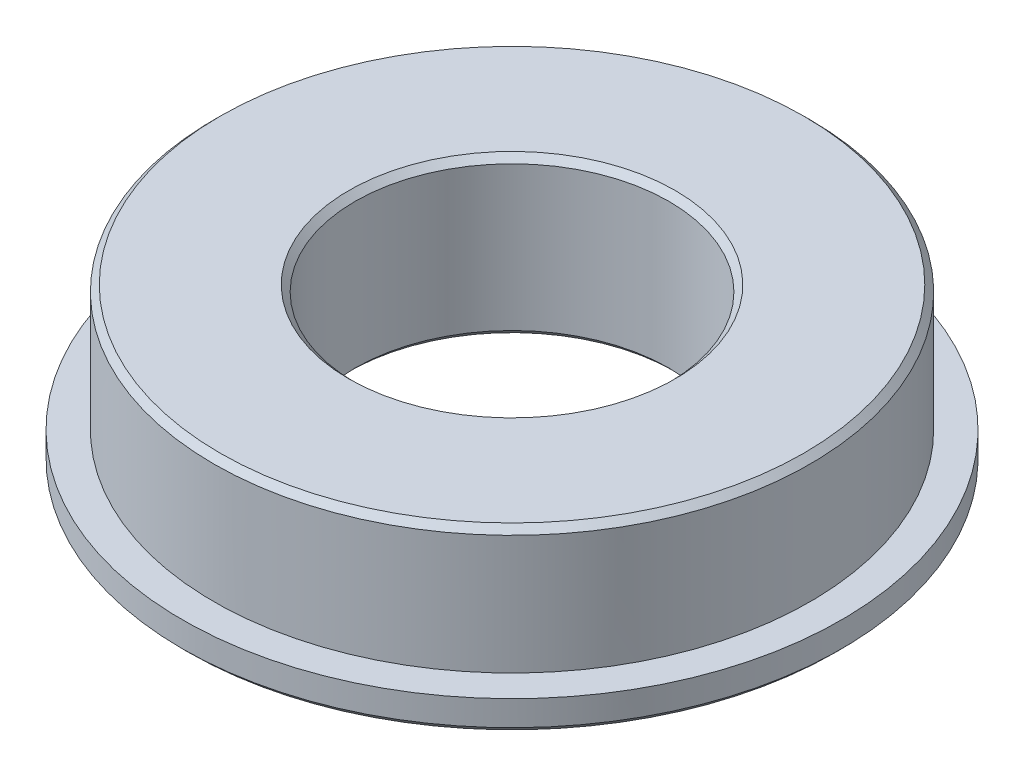
ISO-10303-21;
HEADER;
FILE_DESCRIPTION(('STEP AP214'),'2;1');
FILE_NAME('part.step','',(''),(''),'','','');
FILE_SCHEMA(('AUTOMOTIVE_DESIGN { 1 0 10303 214 1 1 1 1 }'));
ENDSEC;
DATA;
#1=APPLICATION_CONTEXT('core data for automotive mechanical design processes');
#2=APPLICATION_PROTOCOL_DEFINITION('international standard','automotive_design',2000,#1);
#3=PRODUCT_CONTEXT('',#1,'mechanical');
#4=PRODUCT('Part','Part','',(#3));
#5=PRODUCT_RELATED_PRODUCT_CATEGORY('part','',(#4));
#6=PRODUCT_DEFINITION_FORMATION('','',#4);
#7=PRODUCT_DEFINITION_CONTEXT('part definition',#1,'design');
#8=PRODUCT_DEFINITION('design','',#6,#7);
#9=PRODUCT_DEFINITION_SHAPE('','',#8);
#10=(LENGTH_UNIT() NAMED_UNIT(*) SI_UNIT(.MILLI.,.METRE.));
#11=(NAMED_UNIT(*) PLANE_ANGLE_UNIT() SI_UNIT($,.RADIAN.));
#12=(NAMED_UNIT(*) SI_UNIT($,.STERADIAN.) SOLID_ANGLE_UNIT());
#13=UNCERTAINTY_MEASURE_WITH_UNIT(LENGTH_MEASURE(1.E-05),#10,'distance_accuracy_value','');
#14=(GEOMETRIC_REPRESENTATION_CONTEXT(3) GLOBAL_UNCERTAINTY_ASSIGNED_CONTEXT((#13)) GLOBAL_UNIT_ASSIGNED_CONTEXT((#10,
#11,#12)) REPRESENTATION_CONTEXT('',''));
#15=CARTESIAN_POINT('',(0.,0.,0.));
#16=DIRECTION('',(0.,0.,1.));
#17=DIRECTION('',(1.,0.,0.));
#18=AXIS2_PLACEMENT_3D('',#15,#16,#17);
#19=CARTESIAN_POINT('',(0.,5.,0.));
#20=DIRECTION('',(0.,-1.,0.));
#21=DIRECTION('',(0.,0.,-1.));
#22=AXIS2_PLACEMENT_3D('',#19,#20,#21);
#23=CYLINDRICAL_SURFACE('',#22,9.5);
#24=CARTESIAN_POINT('',(0.,4.8,0.));
#25=DIRECTION('',(0.,1.,0.));
#26=DIRECTION('',(0.,0.,1.));
#27=AXIS2_PLACEMENT_3D('',#24,#25,#26);
#28=CIRCLE('',#27,9.5);
#29=CARTESIAN_POINT('',(0.,4.8,9.5));
#30=VERTEX_POINT('',#29);
#31=EDGE_CURVE('E10',#30,#30,#28,.F.);
#32=ORIENTED_EDGE('',*,*,#31,.T.);
#33=EDGE_LOOP('',(#32));
#34=FACE_BOUND('',#33,.T.);
#35=CARTESIAN_POINT('',(0.,1.,0.));
#36=DIRECTION('',(0.,-1.,0.));
#37=DIRECTION('',(0.,0.,-1.));
#38=AXIS2_PLACEMENT_3D('',#35,#36,#37);
#39=CIRCLE('',#38,9.5);
#40=CARTESIAN_POINT('',(0.,1.,-9.5));
#41=VERTEX_POINT('',#40);
#42=EDGE_CURVE('E66',#41,#41,#39,.T.);
#43=ORIENTED_EDGE('',*,*,#42,.F.);
#44=EDGE_LOOP('',(#43));
#45=FACE_BOUND('',#44,.T.);
#46=ADVANCED_FACE('F34',(#34,#45),#23,.T.);
#47=CARTESIAN_POINT('',(0.,5.,0.));
#48=DIRECTION('',(0.,1.,0.));
#49=DIRECTION('',(0.,0.,1.));
#50=AXIS2_PLACEMENT_3D('',#47,#48,#49);
#51=PLANE('',#50);
#52=CARTESIAN_POINT('',(0.,5.,0.));
#53=DIRECTION('',(0.,1.,0.));
#54=DIRECTION('',(0.,0.,1.));
#55=AXIS2_PLACEMENT_3D('',#52,#53,#54);
#56=CIRCLE('',#55,9.3);
#57=CARTESIAN_POINT('',(0.,5.,9.3));
#58=VERTEX_POINT('',#57);
#59=EDGE_CURVE('E41',#58,#58,#56,.T.);
#60=ORIENTED_EDGE('',*,*,#59,.T.);
#61=EDGE_LOOP('',(#60));
#62=FACE_BOUND('',#61,.T.);
#63=CARTESIAN_POINT('',(0.,5.,0.));
#64=DIRECTION('',(0.,1.,0.));
#65=DIRECTION('',(0.,0.,1.));
#66=AXIS2_PLACEMENT_3D('',#63,#64,#65);
#67=CIRCLE('',#66,5.2);
#68=CARTESIAN_POINT('',(0.,5.,5.2));
#69=VERTEX_POINT('',#68);
#70=EDGE_CURVE('E45',#69,#69,#67,.F.);
#71=ORIENTED_EDGE('',*,*,#70,.T.);
#72=EDGE_LOOP('',(#71));
#73=FACE_BOUND('',#72,.T.);
#74=ADVANCED_FACE('F91',(#62,#73),#51,.T.);
#75=CARTESIAN_POINT('',(0.,0.,0.));
#76=DIRECTION('',(0.,1.,0.));
#77=DIRECTION('',(0.,0.,1.));
#78=AXIS2_PLACEMENT_3D('',#75,#76,#77);
#79=PLANE('',#78);
#80=CARTESIAN_POINT('',(0.,0.,0.));
#81=DIRECTION('',(0.,1.,0.));
#82=DIRECTION('',(0.,0.,1.));
#83=AXIS2_PLACEMENT_3D('',#80,#81,#82);
#84=CIRCLE('',#83,10.3);
#85=CARTESIAN_POINT('',(0.,0.,10.3));
#86=VERTEX_POINT('',#85);
#87=EDGE_CURVE('E60',#86,#86,#84,.F.);
#88=ORIENTED_EDGE('',*,*,#87,.T.);
#89=EDGE_LOOP('',(#88));
#90=FACE_BOUND('',#89,.T.);
#91=CARTESIAN_POINT('',(0.,0.,0.));
#92=DIRECTION('',(0.,1.,0.));
#93=DIRECTION('',(0.,0.,1.));
#94=AXIS2_PLACEMENT_3D('',#91,#92,#93);
#95=CIRCLE('',#94,5.2);
#96=CARTESIAN_POINT('',(0.,0.,5.2));
#97=VERTEX_POINT('',#96);
#98=EDGE_CURVE('E63',#97,#97,#95,.T.);
#99=ORIENTED_EDGE('',*,*,#98,.T.);
#100=EDGE_LOOP('',(#99));
#101=FACE_BOUND('',#100,.T.);
#102=ADVANCED_FACE('F96',(#90,#101),#79,.F.);
#103=CARTESIAN_POINT('',(0.,5.,0.));
#104=DIRECTION('',(0.,-1.,0.));
#105=DIRECTION('',(0.,0.,-1.));
#106=AXIS2_PLACEMENT_3D('',#103,#104,#105);
#107=CYLINDRICAL_SURFACE('',#106,5.);
#108=CARTESIAN_POINT('',(0.,0.200000000000001,0.));
#109=DIRECTION('',(0.,1.,0.));
#110=DIRECTION('',(0.,0.,1.));
#111=AXIS2_PLACEMENT_3D('',#108,#109,#110);
#112=CIRCLE('',#111,5.);
#113=CARTESIAN_POINT('',(0.,0.200000000000001,5.));
#114=VERTEX_POINT('',#113);
#115=EDGE_CURVE('E49',#114,#114,#112,.F.);
#116=ORIENTED_EDGE('',*,*,#115,.T.);
#117=EDGE_LOOP('',(#116));
#118=FACE_BOUND('',#117,.T.);
#119=CARTESIAN_POINT('',(0.,4.79999999999999,0.));
#120=DIRECTION('',(0.,1.,0.));
#121=DIRECTION('',(0.,0.,1.));
#122=AXIS2_PLACEMENT_3D('',#119,#120,#121);
#123=CIRCLE('',#122,5.);
#124=CARTESIAN_POINT('',(0.,4.79999999999999,5.));
#125=VERTEX_POINT('',#124);
#126=EDGE_CURVE('E54',#125,#125,#123,.T.);
#127=ORIENTED_EDGE('',*,*,#126,.T.);
#128=EDGE_LOOP('',(#127));
#129=FACE_BOUND('',#128,.T.);
#130=ADVANCED_FACE('F87',(#118,#129),#107,.F.);
#131=CARTESIAN_POINT('',(0.,1.,0.));
#132=DIRECTION('',(0.,-1.,0.));
#133=DIRECTION('',(0.,0.,-1.));
#134=AXIS2_PLACEMENT_3D('',#131,#132,#133);
#135=CYLINDRICAL_SURFACE('',#134,10.5);
#136=CARTESIAN_POINT('',(0.,0.200000000000014,0.));
#137=DIRECTION('',(0.,1.,0.));
#138=DIRECTION('',(0.,0.,1.));
#139=AXIS2_PLACEMENT_3D('',#136,#137,#138);
#140=CIRCLE('',#139,10.5);
#141=CARTESIAN_POINT('',(0.,0.200000000000014,10.5));
#142=VERTEX_POINT('',#141);
#143=EDGE_CURVE('E57',#142,#142,#140,.T.);
#144=ORIENTED_EDGE('',*,*,#143,.T.);
#145=EDGE_LOOP('',(#144));
#146=FACE_BOUND('',#145,.T.);
#147=CARTESIAN_POINT('',(0.,1.,0.));
#148=DIRECTION('',(0.,-1.,0.));
#149=DIRECTION('',(0.,0.,-1.));
#150=AXIS2_PLACEMENT_3D('',#147,#148,#149);
#151=CIRCLE('',#150,10.5);
#152=CARTESIAN_POINT('',(0.,1.,-10.5));
#153=VERTEX_POINT('',#152);
#154=EDGE_CURVE('E69',#153,#153,#151,.T.);
#155=ORIENTED_EDGE('',*,*,#154,.T.);
#156=EDGE_LOOP('',(#155));
#157=FACE_BOUND('',#156,.T.);
#158=ADVANCED_FACE('F73',(#146,#157),#135,.T.);
#159=CARTESIAN_POINT('',(0.,1.,0.));
#160=DIRECTION('',(0.,-1.,0.));
#161=DIRECTION('',(0.,0.,-1.));
#162=AXIS2_PLACEMENT_3D('',#159,#160,#161);
#163=PLANE('',#162);
#164=ORIENTED_EDGE('',*,*,#42,.T.);
#165=EDGE_LOOP('',(#164));
#166=FACE_BOUND('',#165,.T.);
#167=ORIENTED_EDGE('',*,*,#154,.F.);
#168=EDGE_LOOP('',(#167));
#169=FACE_BOUND('',#168,.T.);
#170=ADVANCED_FACE('F75',(#166,#169),#163,.F.);
#171=CARTESIAN_POINT('',(0.,0.,0.));
#172=DIRECTION('',(0.,1.,0.));
#173=DIRECTION('',(0.,0.,1.));
#174=AXIS2_PLACEMENT_3D('',#171,#172,#173);
#175=CONICAL_SURFACE('',#174,10.3,0.785398163397431);
#176=ORIENTED_EDGE('',*,*,#143,.F.);
#177=EDGE_LOOP('',(#176));
#178=FACE_BOUND('',#177,.T.);
#179=ORIENTED_EDGE('',*,*,#87,.F.);
#180=EDGE_LOOP('',(#179));
#181=FACE_BOUND('',#180,.T.);
#182=ADVANCED_FACE('F77',(#178,#181),#175,.T.);
#183=CARTESIAN_POINT('',(0.,0.,0.));
#184=DIRECTION('',(0.,-1.,0.));
#185=DIRECTION('',(0.,0.,-1.));
#186=AXIS2_PLACEMENT_3D('',#183,#184,#185);
#187=CONICAL_SURFACE('',#186,5.2,0.785398163397446);
#188=ORIENTED_EDGE('',*,*,#115,.F.);
#189=EDGE_LOOP('',(#188));
#190=FACE_BOUND('',#189,.T.);
#191=ORIENTED_EDGE('',*,*,#98,.F.);
#192=EDGE_LOOP('',(#191));
#193=FACE_BOUND('',#192,.T.);
#194=ADVANCED_FACE('F84',(#190,#193),#187,.F.);
#195=CARTESIAN_POINT('',(0.,5.,0.));
#196=DIRECTION('',(0.,-1.,0.));
#197=DIRECTION('',(0.,0.,-1.));
#198=AXIS2_PLACEMENT_3D('',#195,#196,#197);
#199=CONICAL_SURFACE('',#198,9.3,0.785398163397444);
#200=ORIENTED_EDGE('',*,*,#31,.F.);
#201=EDGE_LOOP('',(#200));
#202=FACE_BOUND('',#201,.T.);
#203=ORIENTED_EDGE('',*,*,#59,.F.);
#204=EDGE_LOOP('',(#203));
#205=FACE_BOUND('',#204,.T.);
#206=ADVANCED_FACE('F102',(#202,#205),#199,.T.);
#207=CARTESIAN_POINT('',(0.,4.79999999999999,0.));
#208=DIRECTION('',(0.,1.,0.));
#209=DIRECTION('',(0.,0.,1.));
#210=AXIS2_PLACEMENT_3D('',#207,#208,#209);
#211=CONICAL_SURFACE('',#210,5.,0.785398163397442);
#212=ORIENTED_EDGE('',*,*,#70,.F.);
#213=EDGE_LOOP('',(#212));
#214=FACE_BOUND('',#213,.T.);
#215=ORIENTED_EDGE('',*,*,#126,.F.);
#216=EDGE_LOOP('',(#215));
#217=FACE_BOUND('',#216,.T.);
#218=ADVANCED_FACE('F36',(#214,#217),#211,.F.);
#219=CLOSED_SHELL('',(#46,#74,#102,#130,#158,#170,#182,#194,#206,#218));
#220=MANIFOLD_SOLID_BREP('B2',#219);
#221=ADVANCED_BREP_SHAPE_REPRESENTATION('',(#18,#220),#14);
#222=SHAPE_DEFINITION_REPRESENTATION(#9,#221);
ENDSEC;
END-ISO-10303-21;
